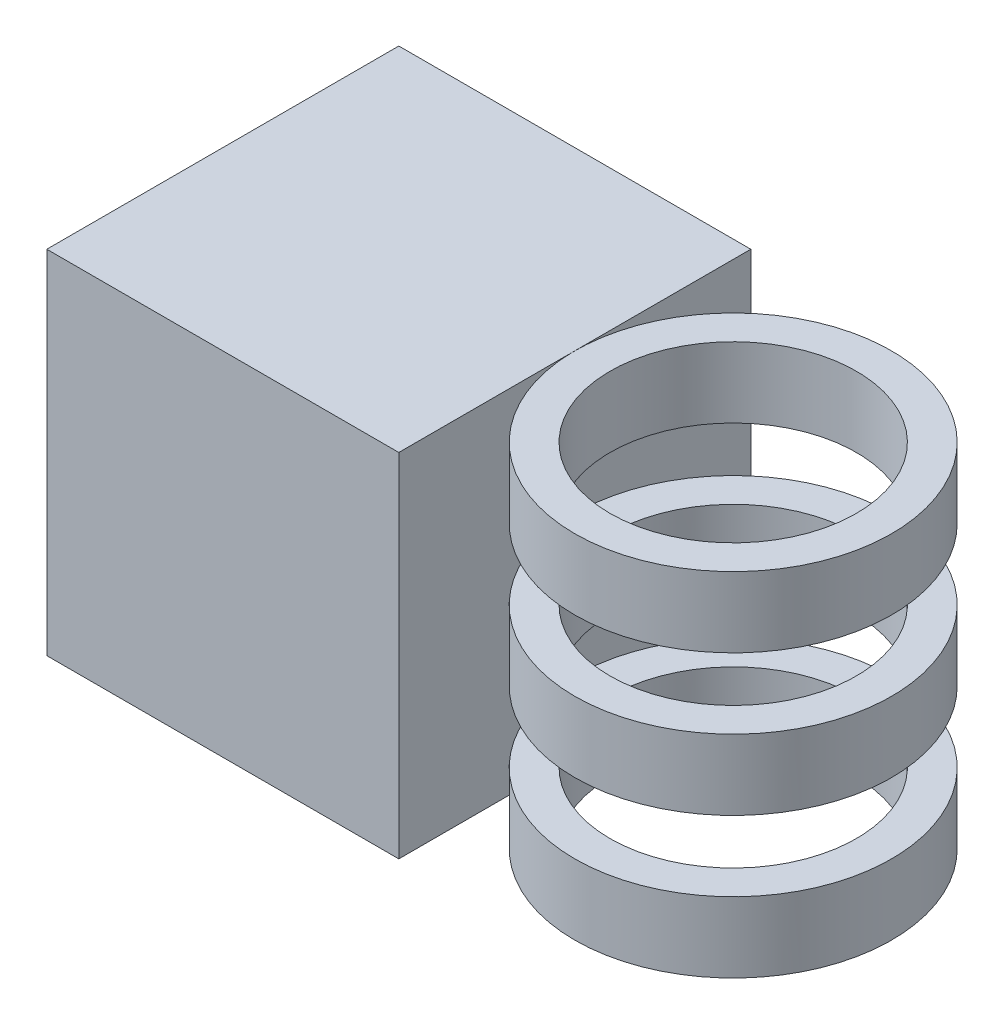
ISO-10303-21;
HEADER;
FILE_DESCRIPTION(('STEP AP214'),'2;1');
FILE_NAME('part.step','',(''),(''),'','','');
FILE_SCHEMA(('AUTOMOTIVE_DESIGN { 1 0 10303 214 1 1 1 1 }'));
ENDSEC;
DATA;
#1=APPLICATION_CONTEXT('core data for automotive mechanical design processes');
#2=APPLICATION_PROTOCOL_DEFINITION('international standard','automotive_design',2000,#1);
#3=PRODUCT_CONTEXT('',#1,'mechanical');
#4=PRODUCT('Part','Part','',(#3));
#5=PRODUCT_RELATED_PRODUCT_CATEGORY('part','',(#4));
#6=PRODUCT_DEFINITION_FORMATION('','',#4);
#7=PRODUCT_DEFINITION_CONTEXT('part definition',#1,'design');
#8=PRODUCT_DEFINITION('design','',#6,#7);
#9=PRODUCT_DEFINITION_SHAPE('','',#8);
#10=(LENGTH_UNIT() NAMED_UNIT(*) SI_UNIT(.MILLI.,.METRE.));
#11=(NAMED_UNIT(*) PLANE_ANGLE_UNIT() SI_UNIT($,.RADIAN.));
#12=(NAMED_UNIT(*) SI_UNIT($,.STERADIAN.) SOLID_ANGLE_UNIT());
#13=UNCERTAINTY_MEASURE_WITH_UNIT(LENGTH_MEASURE(1.E-05),#10,'distance_accuracy_value','');
#14=(GEOMETRIC_REPRESENTATION_CONTEXT(3) GLOBAL_UNCERTAINTY_ASSIGNED_CONTEXT((#13)) GLOBAL_UNIT_ASSIGNED_CONTEXT((#10,
#11,#12)) REPRESENTATION_CONTEXT('',''));
#15=CARTESIAN_POINT('',(0.,0.,0.));
#16=DIRECTION('',(0.,0.,1.));
#17=DIRECTION('',(1.,0.,0.));
#18=AXIS2_PLACEMENT_3D('',#15,#16,#17);
#19=CARTESIAN_POINT('',(7.25,0.,2.5));
#20=DIRECTION('',(0.,1.,0.));
#21=DIRECTION('',(0.,0.,1.));
#22=AXIS2_PLACEMENT_3D('',#19,#20,#21);
#23=CYLINDRICAL_SURFACE('',#22,2.25);
#24=CARTESIAN_POINT('',(7.25,4.,2.5));
#25=DIRECTION('',(0.,1.,0.));
#26=DIRECTION('',(0.,0.,1.));
#27=AXIS2_PLACEMENT_3D('',#24,#25,#26);
#28=CIRCLE('',#27,2.25);
#29=CARTESIAN_POINT('',(7.25,4.,4.75));
#30=VERTEX_POINT('',#29);
#31=EDGE_CURVE('E11',#30,#30,#28,.F.);
#32=ORIENTED_EDGE('',*,*,#31,.F.);
#33=EDGE_LOOP('',(#32));
#34=FACE_BOUND('',#33,.T.);
#35=CARTESIAN_POINT('',(7.25,5.,2.5));
#36=DIRECTION('',(0.,1.,0.));
#37=DIRECTION('',(0.,0.,1.));
#38=AXIS2_PLACEMENT_3D('',#35,#36,#37);
#39=CIRCLE('',#38,2.25);
#40=CARTESIAN_POINT('',(7.25,5.,4.75));
#41=VERTEX_POINT('',#40);
#42=EDGE_CURVE('E57',#41,#41,#39,.T.);
#43=ORIENTED_EDGE('',*,*,#42,.F.);
#44=EDGE_LOOP('',(#43));
#45=FACE_BOUND('',#44,.T.);
#46=ADVANCED_FACE('F50',(#34,#45),#23,.T.);
#47=CARTESIAN_POINT('',(7.25,0.,2.5));
#48=DIRECTION('',(0.,1.,0.));
#49=DIRECTION('',(0.,0.,1.));
#50=AXIS2_PLACEMENT_3D('',#47,#48,#49);
#51=CYLINDRICAL_SURFACE('',#50,1.75);
#52=CARTESIAN_POINT('',(7.25,4.,2.5));
#53=DIRECTION('',(0.,1.,0.));
#54=DIRECTION('',(0.,0.,1.));
#55=AXIS2_PLACEMENT_3D('',#52,#53,#54);
#56=CIRCLE('',#55,1.75);
#57=CARTESIAN_POINT('',(7.25,4.,4.25));
#58=VERTEX_POINT('',#57);
#59=EDGE_CURVE('E66',#58,#58,#56,.F.);
#60=ORIENTED_EDGE('',*,*,#59,.T.);
#61=EDGE_LOOP('',(#60));
#62=FACE_BOUND('',#61,.T.);
#63=CARTESIAN_POINT('',(7.25,5.,2.5));
#64=DIRECTION('',(0.,1.,0.));
#65=DIRECTION('',(0.,0.,1.));
#66=AXIS2_PLACEMENT_3D('',#63,#64,#65);
#67=CIRCLE('',#66,1.75);
#68=CARTESIAN_POINT('',(7.25,5.,4.25));
#69=VERTEX_POINT('',#68);
#70=EDGE_CURVE('E61',#69,#69,#67,.T.);
#71=ORIENTED_EDGE('',*,*,#70,.T.);
#72=EDGE_LOOP('',(#71));
#73=FACE_BOUND('',#72,.T.);
#74=ADVANCED_FACE('F52',(#62,#73),#51,.F.);
#75=CARTESIAN_POINT('',(7.25,5.,2.5));
#76=DIRECTION('',(0.,1.,0.));
#77=DIRECTION('',(0.,0.,1.));
#78=AXIS2_PLACEMENT_3D('',#75,#76,#77);
#79=PLANE('',#78);
#80=ORIENTED_EDGE('',*,*,#70,.F.);
#81=EDGE_LOOP('',(#80));
#82=FACE_BOUND('',#81,.T.);
#83=ORIENTED_EDGE('',*,*,#42,.T.);
#84=EDGE_LOOP('',(#83));
#85=FACE_BOUND('',#84,.T.);
#86=ADVANCED_FACE('F75',(#82,#85),#79,.T.);
#87=CARTESIAN_POINT('',(5.,4.,0.));
#88=DIRECTION('',(0.,1.,0.));
#89=DIRECTION('',(0.,0.,1.));
#90=AXIS2_PLACEMENT_3D('',#87,#88,#89);
#91=PLANE('',#90);
#92=ORIENTED_EDGE('',*,*,#31,.T.);
#93=EDGE_LOOP('',(#92));
#94=FACE_BOUND('',#93,.T.);
#95=ORIENTED_EDGE('',*,*,#59,.F.);
#96=EDGE_LOOP('',(#95));
#97=FACE_BOUND('',#96,.T.);
#98=ADVANCED_FACE('F73',(#94,#97),#91,.F.);
#99=CLOSED_SHELL('',(#46,#74,#86,#98));
#100=MANIFOLD_SOLID_BREP('B2',#99);
#101=CARTESIAN_POINT('',(7.25,0.,2.5));
#102=DIRECTION('',(0.,1.,0.));
#103=DIRECTION('',(0.,0.,1.));
#104=AXIS2_PLACEMENT_3D('',#101,#102,#103);
#105=CYLINDRICAL_SURFACE('',#104,2.25);
#106=CARTESIAN_POINT('',(7.25,1.,2.5));
#107=DIRECTION('',(0.,-1.,0.));
#108=DIRECTION('',(0.,0.,-1.));
#109=AXIS2_PLACEMENT_3D('',#106,#107,#108);
#110=CIRCLE('',#109,2.25);
#111=CARTESIAN_POINT('',(7.25,1.,0.249999999999998));
#112=VERTEX_POINT('',#111);
#113=EDGE_CURVE('E49',#112,#112,#110,.F.);
#114=ORIENTED_EDGE('',*,*,#113,.F.);
#115=EDGE_LOOP('',(#114));
#116=FACE_BOUND('',#115,.T.);
#117=CARTESIAN_POINT('',(7.25,0.,2.5));
#118=DIRECTION('',(0.,1.,0.));
#119=DIRECTION('',(0.,0.,1.));
#120=AXIS2_PLACEMENT_3D('',#117,#118,#119);
#121=CIRCLE('',#120,2.25);
#122=CARTESIAN_POINT('',(7.25,0.,4.75));
#123=VERTEX_POINT('',#122);
#124=EDGE_CURVE('E151',#123,#123,#121,.T.);
#125=ORIENTED_EDGE('',*,*,#124,.T.);
#126=EDGE_LOOP('',(#125));
#127=FACE_BOUND('',#126,.T.);
#128=ADVANCED_FACE('F136',(#116,#127),#105,.T.);
#129=CARTESIAN_POINT('',(7.25,0.,2.5));
#130=DIRECTION('',(0.,1.,0.));
#131=DIRECTION('',(0.,0.,1.));
#132=AXIS2_PLACEMENT_3D('',#129,#130,#131);
#133=PLANE('',#132);
#134=CARTESIAN_POINT('',(7.25,0.,2.5));
#135=DIRECTION('',(0.,1.,0.));
#136=DIRECTION('',(0.,0.,1.));
#137=AXIS2_PLACEMENT_3D('',#134,#135,#136);
#138=CIRCLE('',#137,1.75);
#139=CARTESIAN_POINT('',(7.25,0.,4.25));
#140=VERTEX_POINT('',#139);
#141=EDGE_CURVE('E146',#140,#140,#138,.T.);
#142=ORIENTED_EDGE('',*,*,#141,.T.);
#143=EDGE_LOOP('',(#142));
#144=FACE_BOUND('',#143,.T.);
#145=ORIENTED_EDGE('',*,*,#124,.F.);
#146=EDGE_LOOP('',(#145));
#147=FACE_BOUND('',#146,.T.);
#148=ADVANCED_FACE('F157',(#144,#147),#133,.F.);
#149=CARTESIAN_POINT('',(7.25,0.,2.5));
#150=DIRECTION('',(0.,1.,0.));
#151=DIRECTION('',(0.,0.,1.));
#152=AXIS2_PLACEMENT_3D('',#149,#150,#151);
#153=CYLINDRICAL_SURFACE('',#152,1.75);
#154=CARTESIAN_POINT('',(7.25,1.,2.5));
#155=DIRECTION('',(0.,-1.,0.));
#156=DIRECTION('',(0.,0.,-1.));
#157=AXIS2_PLACEMENT_3D('',#154,#155,#156);
#158=CIRCLE('',#157,1.75);
#159=CARTESIAN_POINT('',(7.25,1.,0.749999999999998));
#160=VERTEX_POINT('',#159);
#161=EDGE_CURVE('E142',#160,#160,#158,.F.);
#162=ORIENTED_EDGE('',*,*,#161,.T.);
#163=EDGE_LOOP('',(#162));
#164=FACE_BOUND('',#163,.T.);
#165=ORIENTED_EDGE('',*,*,#141,.F.);
#166=EDGE_LOOP('',(#165));
#167=FACE_BOUND('',#166,.T.);
#168=ADVANCED_FACE('F159',(#164,#167),#153,.F.);
#169=CARTESIAN_POINT('',(5.,1.,0.));
#170=DIRECTION('',(0.,-1.,0.));
#171=DIRECTION('',(0.,0.,-1.));
#172=AXIS2_PLACEMENT_3D('',#169,#170,#171);
#173=PLANE('',#172);
#174=ORIENTED_EDGE('',*,*,#113,.T.);
#175=EDGE_LOOP('',(#174));
#176=FACE_BOUND('',#175,.T.);
#177=ORIENTED_EDGE('',*,*,#161,.F.);
#178=EDGE_LOOP('',(#177));
#179=FACE_BOUND('',#178,.T.);
#180=ADVANCED_FACE('F166',(#176,#179),#173,.F.);
#181=CLOSED_SHELL('',(#128,#148,#168,#180));
#182=MANIFOLD_SOLID_BREP('B6',#181);
#183=CARTESIAN_POINT('',(7.25,0.,2.5));
#184=DIRECTION('',(0.,1.,0.));
#185=DIRECTION('',(0.,0.,1.));
#186=AXIS2_PLACEMENT_3D('',#183,#184,#185);
#187=CYLINDRICAL_SURFACE('',#186,1.75);
#188=CARTESIAN_POINT('',(7.25,3.,2.5));
#189=DIRECTION('',(0.,-1.,0.));
#190=DIRECTION('',(0.,0.,-1.));
#191=AXIS2_PLACEMENT_3D('',#188,#189,#190);
#192=CIRCLE('',#191,1.75);
#193=CARTESIAN_POINT('',(7.25,3.,0.749999999999998));
#194=VERTEX_POINT('',#193);
#195=EDGE_CURVE('E227',#194,#194,#192,.F.);
#196=ORIENTED_EDGE('',*,*,#195,.T.);
#197=EDGE_LOOP('',(#196));
#198=FACE_BOUND('',#197,.T.);
#199=CARTESIAN_POINT('',(7.25,2.,2.5));
#200=DIRECTION('',(0.,1.,0.));
#201=DIRECTION('',(0.,0.,1.));
#202=AXIS2_PLACEMENT_3D('',#199,#200,#201);
#203=CIRCLE('',#202,1.75);
#204=CARTESIAN_POINT('',(7.25,2.,4.25));
#205=VERTEX_POINT('',#204);
#206=EDGE_CURVE('E237',#205,#205,#203,.F.);
#207=ORIENTED_EDGE('',*,*,#206,.T.);
#208=EDGE_LOOP('',(#207));
#209=FACE_BOUND('',#208,.T.);
#210=ADVANCED_FACE('F223',(#198,#209),#187,.F.);
#211=CARTESIAN_POINT('',(5.,2.,0.));
#212=DIRECTION('',(0.,1.,0.));
#213=DIRECTION('',(0.,0.,1.));
#214=AXIS2_PLACEMENT_3D('',#211,#212,#213);
#215=PLANE('',#214);
#216=CARTESIAN_POINT('',(7.25,2.,2.5));
#217=DIRECTION('',(0.,1.,0.));
#218=DIRECTION('',(0.,0.,1.));
#219=AXIS2_PLACEMENT_3D('',#216,#217,#218);
#220=CIRCLE('',#219,2.25);
#221=CARTESIAN_POINT('',(7.25,2.,4.75));
#222=VERTEX_POINT('',#221);
#223=EDGE_CURVE('E235',#222,#222,#220,.F.);
#224=ORIENTED_EDGE('',*,*,#223,.T.);
#225=EDGE_LOOP('',(#224));
#226=FACE_BOUND('',#225,.T.);
#227=ORIENTED_EDGE('',*,*,#206,.F.);
#228=EDGE_LOOP('',(#227));
#229=FACE_BOUND('',#228,.T.);
#230=ADVANCED_FACE('F244',(#226,#229),#215,.F.);
#231=CARTESIAN_POINT('',(5.,3.,0.));
#232=DIRECTION('',(0.,-1.,0.));
#233=DIRECTION('',(0.,0.,-1.));
#234=AXIS2_PLACEMENT_3D('',#231,#232,#233);
#235=PLANE('',#234);
#236=CARTESIAN_POINT('',(7.25,3.,2.5));
#237=DIRECTION('',(0.,-1.,0.));
#238=DIRECTION('',(0.,0.,-1.));
#239=AXIS2_PLACEMENT_3D('',#236,#237,#238);
#240=CIRCLE('',#239,2.25);
#241=CARTESIAN_POINT('',(7.25,3.,0.249999999999998));
#242=VERTEX_POINT('',#241);
#243=EDGE_CURVE('E135',#242,#242,#240,.F.);
#244=ORIENTED_EDGE('',*,*,#243,.T.);
#245=EDGE_LOOP('',(#244));
#246=FACE_BOUND('',#245,.T.);
#247=ORIENTED_EDGE('',*,*,#195,.F.);
#248=EDGE_LOOP('',(#247));
#249=FACE_BOUND('',#248,.T.);
#250=ADVANCED_FACE('F248',(#246,#249),#235,.F.);
#251=CARTESIAN_POINT('',(7.25,0.,2.5));
#252=DIRECTION('',(0.,1.,0.));
#253=DIRECTION('',(0.,0.,1.));
#254=AXIS2_PLACEMENT_3D('',#251,#252,#253);
#255=CYLINDRICAL_SURFACE('',#254,2.25);
#256=ORIENTED_EDGE('',*,*,#243,.F.);
#257=EDGE_LOOP('',(#256));
#258=FACE_BOUND('',#257,.T.);
#259=ORIENTED_EDGE('',*,*,#223,.F.);
#260=EDGE_LOOP('',(#259));
#261=FACE_BOUND('',#260,.T.);
#262=ADVANCED_FACE('F225',(#258,#261),#255,.T.);
#263=CLOSED_SHELL('',(#210,#230,#250,#262));
#264=MANIFOLD_SOLID_BREP('B44',#263);
#265=CARTESIAN_POINT('',(5.,0.,5.));
#266=DIRECTION('',(0.,1.,0.));
#267=DIRECTION('',(-1.,0.,0.));
#268=AXIS2_PLACEMENT_3D('',#265,#266,#267);
#269=PLANE('',#268);
#270=DIRECTION('',(1.,0.,0.));
#271=VECTOR('',#270,1.);
#272=CARTESIAN_POINT('',(5.,0.,0.));
#273=LINE('',#272,#271);
#274=CARTESIAN_POINT('',(0.,0.,0.));
#275=VERTEX_POINT('',#274);
#276=CARTESIAN_POINT('',(5.,0.,0.));
#277=VERTEX_POINT('',#276);
#278=EDGE_CURVE('E364',#275,#277,#273,.T.);
#279=ORIENTED_EDGE('',*,*,#278,.T.);
#280=DIRECTION('',(0.,0.,-1.));
#281=VECTOR('',#280,1.);
#282=CARTESIAN_POINT('',(5.,0.,5.));
#283=LINE('',#282,#281);
#284=CARTESIAN_POINT('',(5.,0.,5.));
#285=VERTEX_POINT('',#284);
#286=EDGE_CURVE('E221',#285,#277,#283,.T.);
#287=ORIENTED_EDGE('',*,*,#286,.F.);
#288=DIRECTION('',(1.,0.,0.));
#289=VECTOR('',#288,1.);
#290=CARTESIAN_POINT('',(5.,0.,5.));
#291=LINE('',#290,#289);
#292=CARTESIAN_POINT('',(0.,0.,5.));
#293=VERTEX_POINT('',#292);
#294=EDGE_CURVE('E352',#293,#285,#291,.T.);
#295=ORIENTED_EDGE('',*,*,#294,.F.);
#296=DIRECTION('',(0.,0.,-1.));
#297=VECTOR('',#296,1.);
#298=CARTESIAN_POINT('',(0.,0.,5.));
#299=LINE('',#298,#297);
#300=EDGE_CURVE('E360',#293,#275,#299,.T.);
#301=ORIENTED_EDGE('',*,*,#300,.T.);
#302=EDGE_LOOP('',(#279,#287,#295,#301));
#303=FACE_BOUND('',#302,.T.);
#304=ADVANCED_FACE('F301',(#303),#269,.F.);
#305=CARTESIAN_POINT('',(5.,5.,5.));
#306=DIRECTION('',(-1.,0.,0.));
#307=DIRECTION('',(0.,-1.,0.));
#308=AXIS2_PLACEMENT_3D('',#305,#306,#307);
#309=PLANE('',#308);
#310=DIRECTION('',(0.,1.,0.));
#311=VECTOR('',#310,1.);
#312=CARTESIAN_POINT('',(5.,5.,0.));
#313=LINE('',#312,#311);
#314=CARTESIAN_POINT('',(5.,5.,0.));
#315=VERTEX_POINT('',#314);
#316=EDGE_CURVE('E356',#277,#315,#313,.T.);
#317=ORIENTED_EDGE('',*,*,#316,.T.);
#318=DIRECTION('',(0.,0.,-1.));
#319=VECTOR('',#318,1.);
#320=CARTESIAN_POINT('',(5.,5.,5.));
#321=LINE('',#320,#319);
#322=CARTESIAN_POINT('',(5.,5.,5.));
#323=VERTEX_POINT('',#322);
#324=EDGE_CURVE('E309',#323,#315,#321,.T.);
#325=ORIENTED_EDGE('',*,*,#324,.F.);
#326=DIRECTION('',(0.,1.,0.));
#327=VECTOR('',#326,1.);
#328=CARTESIAN_POINT('',(5.,5.,5.));
#329=LINE('',#328,#327);
#330=EDGE_CURVE('E347',#285,#323,#329,.T.);
#331=ORIENTED_EDGE('',*,*,#330,.F.);
#332=ORIENTED_EDGE('',*,*,#286,.T.);
#333=EDGE_LOOP('',(#317,#325,#331,#332));
#334=FACE_BOUND('',#333,.T.);
#335=ADVANCED_FACE('F355',(#334),#309,.F.);
#336=CARTESIAN_POINT('',(0.,5.,5.));
#337=DIRECTION('',(0.,-1.,0.));
#338=DIRECTION('',(0.,0.,-1.));
#339=AXIS2_PLACEMENT_3D('',#336,#337,#338);
#340=PLANE('',#339);
#341=DIRECTION('',(-1.,0.,0.));
#342=VECTOR('',#341,1.);
#343=CARTESIAN_POINT('',(0.,5.,0.));
#344=LINE('',#343,#342);
#345=CARTESIAN_POINT('',(0.,5.,0.));
#346=VERTEX_POINT('',#345);
#347=EDGE_CURVE('E334',#315,#346,#344,.T.);
#348=ORIENTED_EDGE('',*,*,#347,.T.);
#349=DIRECTION('',(0.,0.,-1.));
#350=VECTOR('',#349,1.);
#351=CARTESIAN_POINT('',(0.,5.,5.));
#352=LINE('',#351,#350);
#353=CARTESIAN_POINT('',(0.,5.,5.));
#354=VERTEX_POINT('',#353);
#355=EDGE_CURVE('E357',#354,#346,#352,.T.);
#356=ORIENTED_EDGE('',*,*,#355,.F.);
#357=DIRECTION('',(-1.,0.,0.));
#358=VECTOR('',#357,1.);
#359=CARTESIAN_POINT('',(0.,5.,5.));
#360=LINE('',#359,#358);
#361=EDGE_CURVE('E350',#323,#354,#360,.T.);
#362=ORIENTED_EDGE('',*,*,#361,.F.);
#363=ORIENTED_EDGE('',*,*,#324,.T.);
#364=EDGE_LOOP('',(#348,#356,#362,#363));
#365=FACE_BOUND('',#364,.T.);
#366=ADVANCED_FACE('F358',(#365),#340,.F.);
#367=CARTESIAN_POINT('',(0.,0.,5.));
#368=DIRECTION('',(1.,0.,0.));
#369=DIRECTION('',(0.,0.,-1.));
#370=AXIS2_PLACEMENT_3D('',#367,#368,#369);
#371=PLANE('',#370);
#372=DIRECTION('',(0.,-1.,0.));
#373=VECTOR('',#372,1.);
#374=CARTESIAN_POINT('',(0.,0.,0.));
#375=LINE('',#374,#373);
#376=EDGE_CURVE('E340',#346,#275,#375,.T.);
#377=ORIENTED_EDGE('',*,*,#376,.T.);
#378=ORIENTED_EDGE('',*,*,#300,.F.);
#379=DIRECTION('',(0.,-1.,0.));
#380=VECTOR('',#379,1.);
#381=CARTESIAN_POINT('',(0.,0.,5.));
#382=LINE('',#381,#380);
#383=EDGE_CURVE('E317',#354,#293,#382,.T.);
#384=ORIENTED_EDGE('',*,*,#383,.F.);
#385=ORIENTED_EDGE('',*,*,#355,.T.);
#386=EDGE_LOOP('',(#377,#378,#384,#385));
#387=FACE_BOUND('',#386,.T.);
#388=ADVANCED_FACE('F371',(#387),#371,.F.);
#389=CARTESIAN_POINT('',(0.,0.,5.));
#390=DIRECTION('',(0.,0.,-1.));
#391=DIRECTION('',(-1.,0.,0.));
#392=AXIS2_PLACEMENT_3D('',#389,#390,#391);
#393=PLANE('',#392);
#394=ORIENTED_EDGE('',*,*,#294,.T.);
#395=ORIENTED_EDGE('',*,*,#330,.T.);
#396=ORIENTED_EDGE('',*,*,#361,.T.);
#397=ORIENTED_EDGE('',*,*,#383,.T.);
#398=EDGE_LOOP('',(#394,#395,#396,#397));
#399=FACE_BOUND('',#398,.T.);
#400=ADVANCED_FACE('F348',(#399),#393,.F.);
#401=CARTESIAN_POINT('',(0.,0.,0.));
#402=DIRECTION('',(0.,0.,-1.));
#403=DIRECTION('',(-1.,0.,0.));
#404=AXIS2_PLACEMENT_3D('',#401,#402,#403);
#405=PLANE('',#404);
#406=ORIENTED_EDGE('',*,*,#278,.F.);
#407=ORIENTED_EDGE('',*,*,#376,.F.);
#408=ORIENTED_EDGE('',*,*,#347,.F.);
#409=ORIENTED_EDGE('',*,*,#316,.F.);
#410=EDGE_LOOP('',(#406,#407,#408,#409));
#411=FACE_BOUND('',#410,.T.);
#412=ADVANCED_FACE('F374',(#411),#405,.T.);
#413=CLOSED_SHELL('',(#304,#335,#366,#388,#400,#412));
#414=MANIFOLD_SOLID_BREP('B130',#413);
#415=ADVANCED_BREP_SHAPE_REPRESENTATION('',(#18,#100,#182,#264,#414),#14);
#416=SHAPE_DEFINITION_REPRESENTATION(#9,#415);
ENDSEC;
END-ISO-10303-21;
